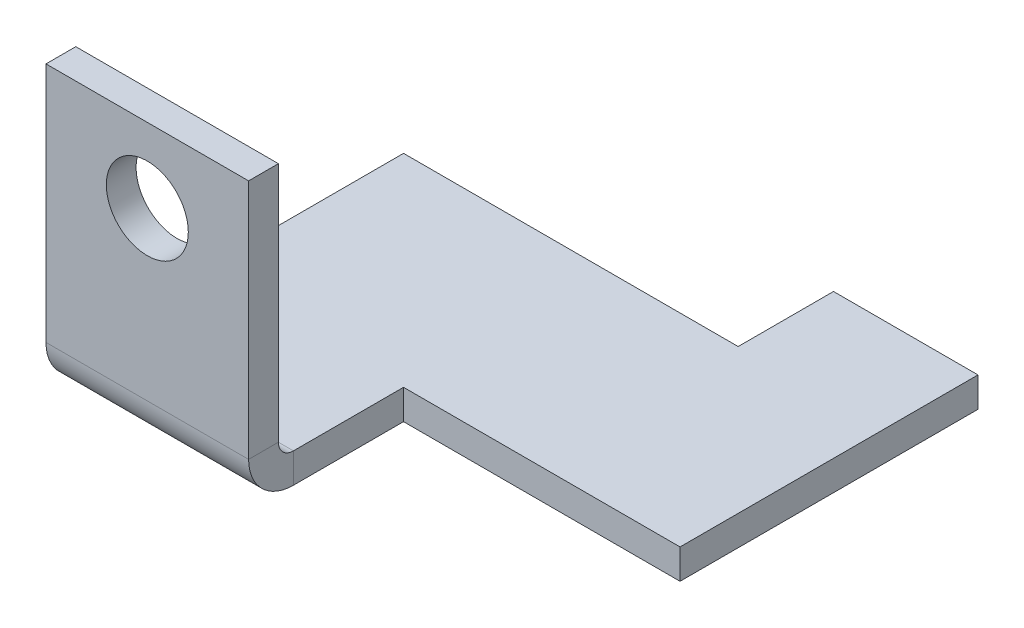
ISO-10303-21;
HEADER;
FILE_DESCRIPTION(('STEP AP214'),'2;1');
FILE_NAME('part.step','',(''),(''),'','','');
FILE_SCHEMA(('AUTOMOTIVE_DESIGN { 1 0 10303 214 1 1 1 1 }'));
ENDSEC;
DATA;
#1=APPLICATION_CONTEXT('core data for automotive mechanical design processes');
#2=APPLICATION_PROTOCOL_DEFINITION('international standard','automotive_design',2000,#1);
#3=PRODUCT_CONTEXT('',#1,'mechanical');
#4=PRODUCT('Part','Part','',(#3));
#5=PRODUCT_RELATED_PRODUCT_CATEGORY('part','',(#4));
#6=PRODUCT_DEFINITION_FORMATION('','',#4);
#7=PRODUCT_DEFINITION_CONTEXT('part definition',#1,'design');
#8=PRODUCT_DEFINITION('design','',#6,#7);
#9=PRODUCT_DEFINITION_SHAPE('','',#8);
#10=(LENGTH_UNIT() NAMED_UNIT(*) SI_UNIT(.MILLI.,.METRE.));
#11=(NAMED_UNIT(*) PLANE_ANGLE_UNIT() SI_UNIT($,.RADIAN.));
#12=(NAMED_UNIT(*) SI_UNIT($,.STERADIAN.) SOLID_ANGLE_UNIT());
#13=UNCERTAINTY_MEASURE_WITH_UNIT(LENGTH_MEASURE(1.E-05),#10,'distance_accuracy_value','');
#14=(GEOMETRIC_REPRESENTATION_CONTEXT(3) GLOBAL_UNCERTAINTY_ASSIGNED_CONTEXT((#13)) GLOBAL_UNIT_ASSIGNED_CONTEXT((#10,
#11,#12)) REPRESENTATION_CONTEXT('',''));
#15=CARTESIAN_POINT('',(0.,0.,0.));
#16=DIRECTION('',(0.,0.,1.));
#17=DIRECTION('',(1.,0.,0.));
#18=AXIS2_PLACEMENT_3D('',#15,#16,#17);
#19=CARTESIAN_POINT('',(-10.795,15.24,3.175));
#20=DIRECTION('',(-1.,0.,0.));
#21=DIRECTION('',(0.,-1.,0.));
#22=AXIS2_PLACEMENT_3D('',#19,#20,#21);
#23=PLANE('',#22);
#24=DIRECTION('',(0.,1.,0.));
#25=VECTOR('',#24,1.);
#26=CARTESIAN_POINT('',(-10.795,0.,0.));
#27=LINE('',#26,#25);
#28=CARTESIAN_POINT('',(-10.795,15.24,0.));
#29=VERTEX_POINT('',#28);
#30=CARTESIAN_POINT('',(-10.795,-10.464999898,0.));
#31=VERTEX_POINT('',#30);
#32=EDGE_CURVE('E212',#29,#31,#27,.F.);
#33=ORIENTED_EDGE('',*,*,#32,.T.);
#34=DIRECTION('',(0.,0.,1.));
#35=VECTOR('',#34,1.);
#36=CARTESIAN_POINT('',(-10.795,-10.464999898,0.));
#37=LINE('',#36,#35);
#38=CARTESIAN_POINT('',(-10.795,-10.464999898,3.175));
#39=VERTEX_POINT('',#38);
#40=EDGE_CURVE('E161',#31,#39,#37,.T.);
#41=ORIENTED_EDGE('',*,*,#40,.T.);
#42=DIRECTION('',(0.,-1.,0.));
#43=VECTOR('',#42,1.);
#44=CARTESIAN_POINT('',(-10.795,15.24,3.175));
#45=LINE('',#44,#43);
#46=CARTESIAN_POINT('',(-10.795,15.24,3.175));
#47=VERTEX_POINT('',#46);
#48=EDGE_CURVE('E204',#47,#39,#45,.T.);
#49=ORIENTED_EDGE('',*,*,#48,.F.);
#50=DIRECTION('',(0.,0.,1.));
#51=VECTOR('',#50,1.);
#52=CARTESIAN_POINT('',(-10.795,15.24,3.175));
#53=LINE('',#52,#51);
#54=EDGE_CURVE('E13',#29,#47,#53,.T.);
#55=ORIENTED_EDGE('',*,*,#54,.F.);
#56=EDGE_LOOP('',(#33,#41,#49,#55));
#57=FACE_BOUND('',#56,.T.);
#58=ADVANCED_FACE('F79',(#57),#23,.T.);
#59=CARTESIAN_POINT('',(0.,0.,3.175));
#60=DIRECTION('',(0.,0.,1.));
#61=DIRECTION('',(1.,0.,0.));
#62=AXIS2_PLACEMENT_3D('',#59,#60,#61);
#63=PLANE('',#62);
#64=CARTESIAN_POINT('',(0.,7.3025,3.175));
#65=DIRECTION('',(0.,0.,1.));
#66=DIRECTION('',(1.,0.,0.));
#67=AXIS2_PLACEMENT_3D('',#64,#65,#66);
#68=CIRCLE('',#67,4.3688);
#69=CARTESIAN_POINT('',(4.3688,7.3025,3.175));
#70=VERTEX_POINT('',#69);
#71=EDGE_CURVE('E207',#70,#70,#68,.T.);
#72=ORIENTED_EDGE('',*,*,#71,.F.);
#73=EDGE_LOOP('',(#72));
#74=FACE_BOUND('',#73,.T.);
#75=ORIENTED_EDGE('',*,*,#48,.T.);
#76=DIRECTION('',(-1.,0.,0.));
#77=VECTOR('',#76,1.);
#78=CARTESIAN_POINT('',(-10.795,-10.464999898,3.175));
#79=LINE('',#78,#77);
#80=CARTESIAN_POINT('',(10.795,-10.464999898,3.175));
#81=VERTEX_POINT('',#80);
#82=EDGE_CURVE('E121',#39,#81,#79,.F.);
#83=ORIENTED_EDGE('',*,*,#82,.T.);
#84=DIRECTION('',(0.,1.,0.));
#85=VECTOR('',#84,1.);
#86=CARTESIAN_POINT('',(10.795,15.24,3.175));
#87=LINE('',#86,#85);
#88=CARTESIAN_POINT('',(10.795,15.24,3.175));
#89=VERTEX_POINT('',#88);
#90=EDGE_CURVE('E199',#81,#89,#87,.T.);
#91=ORIENTED_EDGE('',*,*,#90,.T.);
#92=DIRECTION('',(-1.,0.,0.));
#93=VECTOR('',#92,1.);
#94=CARTESIAN_POINT('',(-10.795,15.24,3.175));
#95=LINE('',#94,#93);
#96=EDGE_CURVE('E201',#89,#47,#95,.T.);
#97=ORIENTED_EDGE('',*,*,#96,.T.);
#98=EDGE_LOOP('',(#75,#83,#91,#97));
#99=FACE_BOUND('',#98,.T.);
#100=ADVANCED_FACE('F235',(#74,#99),#63,.T.);
#101=CARTESIAN_POINT('',(0.,0.,0.));
#102=DIRECTION('',(0.,0.,1.));
#103=DIRECTION('',(1.,0.,0.));
#104=AXIS2_PLACEMENT_3D('',#101,#102,#103);
#105=PLANE('',#104);
#106=CARTESIAN_POINT('',(0.,7.3025,0.));
#107=DIRECTION('',(0.,0.,1.));
#108=DIRECTION('',(1.,0.,0.));
#109=AXIS2_PLACEMENT_3D('',#106,#107,#108);
#110=CIRCLE('',#109,4.3688);
#111=CARTESIAN_POINT('',(4.3688,7.3025,0.));
#112=VERTEX_POINT('',#111);
#113=EDGE_CURVE('E202',#112,#112,#110,.T.);
#114=ORIENTED_EDGE('',*,*,#113,.T.);
#115=EDGE_LOOP('',(#114));
#116=FACE_BOUND('',#115,.T.);
#117=DIRECTION('',(-1.,0.,0.));
#118=VECTOR('',#117,1.);
#119=CARTESIAN_POINT('',(-10.795,-10.464999898,0.));
#120=LINE('',#119,#118);
#121=CARTESIAN_POINT('',(10.795,-10.464999898,0.));
#122=VERTEX_POINT('',#121);
#123=EDGE_CURVE('E162',#31,#122,#120,.F.);
#124=ORIENTED_EDGE('',*,*,#123,.F.);
#125=ORIENTED_EDGE('',*,*,#32,.F.);
#126=DIRECTION('',(1.,0.,0.));
#127=VECTOR('',#126,1.);
#128=CARTESIAN_POINT('',(0.,15.24,0.));
#129=LINE('',#128,#127);
#130=CARTESIAN_POINT('',(10.795,15.24,0.));
#131=VERTEX_POINT('',#130);
#132=EDGE_CURVE('E211',#131,#29,#129,.F.);
#133=ORIENTED_EDGE('',*,*,#132,.F.);
#134=DIRECTION('',(0.,1.,0.));
#135=VECTOR('',#134,1.);
#136=CARTESIAN_POINT('',(10.795,0.,0.));
#137=LINE('',#136,#135);
#138=EDGE_CURVE('E115',#122,#131,#137,.T.);
#139=ORIENTED_EDGE('',*,*,#138,.F.);
#140=EDGE_LOOP('',(#124,#125,#133,#139));
#141=FACE_BOUND('',#140,.T.);
#142=ADVANCED_FACE('F219',(#116,#141),#105,.F.);
#143=CARTESIAN_POINT('',(10.795,15.24,3.175));
#144=DIRECTION('',(1.,0.,0.));
#145=DIRECTION('',(0.,1.,0.));
#146=AXIS2_PLACEMENT_3D('',#143,#144,#145);
#147=PLANE('',#146);
#148=DIRECTION('',(0.,0.,1.));
#149=VECTOR('',#148,1.);
#150=CARTESIAN_POINT('',(10.795,-10.464999898,0.));
#151=LINE('',#150,#149);
#152=EDGE_CURVE('E196',#122,#81,#151,.T.);
#153=ORIENTED_EDGE('',*,*,#152,.F.);
#154=ORIENTED_EDGE('',*,*,#138,.T.);
#155=DIRECTION('',(0.,0.,1.));
#156=VECTOR('',#155,1.);
#157=CARTESIAN_POINT('',(10.795,15.24,3.175));
#158=LINE('',#157,#156);
#159=EDGE_CURVE('E83',#131,#89,#158,.T.);
#160=ORIENTED_EDGE('',*,*,#159,.T.);
#161=ORIENTED_EDGE('',*,*,#90,.F.);
#162=EDGE_LOOP('',(#153,#154,#160,#161));
#163=FACE_BOUND('',#162,.T.);
#164=ADVANCED_FACE('F233',(#163),#147,.T.);
#165=CARTESIAN_POINT('',(-10.795,15.24,3.175));
#166=DIRECTION('',(0.,1.,0.));
#167=DIRECTION('',(-1.,0.,0.));
#168=AXIS2_PLACEMENT_3D('',#165,#166,#167);
#169=PLANE('',#168);
#170=ORIENTED_EDGE('',*,*,#132,.T.);
#171=ORIENTED_EDGE('',*,*,#54,.T.);
#172=ORIENTED_EDGE('',*,*,#96,.F.);
#173=ORIENTED_EDGE('',*,*,#159,.F.);
#174=EDGE_LOOP('',(#170,#171,#172,#173));
#175=FACE_BOUND('',#174,.T.);
#176=ADVANCED_FACE('F224',(#175),#169,.T.);
#177=CARTESIAN_POINT('',(0.,7.3025,3.175));
#178=DIRECTION('',(0.,0.,1.));
#179=DIRECTION('',(1.,0.,0.));
#180=AXIS2_PLACEMENT_3D('',#177,#178,#179);
#181=CYLINDRICAL_SURFACE('',#180,4.3688);
#182=ORIENTED_EDGE('',*,*,#71,.T.);
#183=EDGE_LOOP('',(#182));
#184=FACE_BOUND('',#183,.T.);
#185=ORIENTED_EDGE('',*,*,#113,.F.);
#186=EDGE_LOOP('',(#185));
#187=FACE_BOUND('',#186,.T.);
#188=ADVANCED_FACE('F81',(#184,#187),#181,.F.);
#189=CARTESIAN_POINT('',(10.795,-10.464999898,-1.600000102));
#190=DIRECTION('',(1.,0.,0.));
#191=DIRECTION('',(0.,0.,-1.));
#192=AXIS2_PLACEMENT_3D('',#189,#190,#191);
#193=PLANE('',#192);
#194=DIRECTION('',(0.,-1.,0.));
#195=VECTOR('',#194,1.);
#196=CARTESIAN_POINT('',(10.795,-15.24,-1.60000010199998));
#197=LINE('',#196,#195);
#198=CARTESIAN_POINT('',(10.795,-12.065,-1.60000010199999));
#199=VERTEX_POINT('',#198);
#200=CARTESIAN_POINT('',(10.795,-15.24,-1.60000010199998));
#201=VERTEX_POINT('',#200);
#202=EDGE_CURVE('E153',#199,#201,#197,.T.);
#203=ORIENTED_EDGE('',*,*,#202,.F.);
#204=CARTESIAN_POINT('',(10.795,-10.464999898,-1.600000102));
#205=DIRECTION('',(-1.,0.,0.));
#206=DIRECTION('',(0.,0.,1.));
#207=AXIS2_PLACEMENT_3D('',#204,#205,#206);
#208=CIRCLE('',#207,1.600000102);
#209=EDGE_CURVE('E147',#122,#199,#208,.F.);
#210=ORIENTED_EDGE('',*,*,#209,.F.);
#211=ORIENTED_EDGE('',*,*,#152,.T.);
#212=CARTESIAN_POINT('',(10.795,-10.464999898,-1.600000102));
#213=DIRECTION('',(-1.,0.,0.));
#214=DIRECTION('',(0.,0.,1.));
#215=AXIS2_PLACEMENT_3D('',#212,#213,#214);
#216=CIRCLE('',#215,4.775000102);
#217=EDGE_CURVE('E94',#81,#201,#216,.F.);
#218=ORIENTED_EDGE('',*,*,#217,.T.);
#219=EDGE_LOOP('',(#203,#210,#211,#218));
#220=FACE_BOUND('',#219,.T.);
#221=ADVANCED_FACE('F223',(#220),#193,.T.);
#222=CARTESIAN_POINT('',(-10.795,-10.464999898,-1.600000102));
#223=DIRECTION('',(1.,0.,0.));
#224=DIRECTION('',(0.,0.,-1.));
#225=AXIS2_PLACEMENT_3D('',#222,#223,#224);
#226=PLANE('',#225);
#227=CARTESIAN_POINT('',(-10.795,-10.464999898,-1.600000102));
#228=DIRECTION('',(-1.,0.,0.));
#229=DIRECTION('',(0.,0.,1.));
#230=AXIS2_PLACEMENT_3D('',#227,#228,#229);
#231=CIRCLE('',#230,1.600000102);
#232=CARTESIAN_POINT('',(-10.795,-12.065,-1.60000010199999));
#233=VERTEX_POINT('',#232);
#234=EDGE_CURVE('E144',#233,#31,#231,.T.);
#235=ORIENTED_EDGE('',*,*,#234,.F.);
#236=DIRECTION('',(0.,-1.,0.));
#237=VECTOR('',#236,1.);
#238=CARTESIAN_POINT('',(-10.795,-12.065,-1.60000010199999));
#239=LINE('',#238,#237);
#240=CARTESIAN_POINT('',(-10.795,-15.24,-1.60000010199998));
#241=VERTEX_POINT('',#240);
#242=EDGE_CURVE('E152',#233,#241,#239,.T.);
#243=ORIENTED_EDGE('',*,*,#242,.T.);
#244=CARTESIAN_POINT('',(-10.795,-10.464999898,-1.600000102));
#245=DIRECTION('',(-1.,0.,0.));
#246=DIRECTION('',(0.,0.,1.));
#247=AXIS2_PLACEMENT_3D('',#244,#245,#246);
#248=CIRCLE('',#247,4.775000102);
#249=EDGE_CURVE('E191',#241,#39,#248,.T.);
#250=ORIENTED_EDGE('',*,*,#249,.T.);
#251=ORIENTED_EDGE('',*,*,#40,.F.);
#252=EDGE_LOOP('',(#235,#243,#250,#251));
#253=FACE_BOUND('',#252,.T.);
#254=ADVANCED_FACE('F157',(#253),#226,.F.);
#255=CARTESIAN_POINT('',(-10.795,-10.464999898,-1.600000102));
#256=DIRECTION('',(-1.,0.,0.));
#257=DIRECTION('',(0.,-1.,0.));
#258=AXIS2_PLACEMENT_3D('',#255,#256,#257);
#259=CYLINDRICAL_SURFACE('',#258,4.775000102);
#260=ORIENTED_EDGE('',*,*,#82,.F.);
#261=ORIENTED_EDGE('',*,*,#249,.F.);
#262=DIRECTION('',(-1.,0.,0.));
#263=VECTOR('',#262,1.);
#264=CARTESIAN_POINT('',(0.,-15.24,-1.60000010199998));
#265=LINE('',#264,#263);
#266=EDGE_CURVE('E182',#201,#241,#265,.T.);
#267=ORIENTED_EDGE('',*,*,#266,.F.);
#268=ORIENTED_EDGE('',*,*,#217,.F.);
#269=EDGE_LOOP('',(#260,#261,#267,#268));
#270=FACE_BOUND('',#269,.T.);
#271=ADVANCED_FACE('F249',(#270),#259,.T.);
#272=CARTESIAN_POINT('',(-10.795,-10.464999898,-1.600000102));
#273=DIRECTION('',(-1.,0.,0.));
#274=DIRECTION('',(0.,-1.,0.));
#275=AXIS2_PLACEMENT_3D('',#272,#273,#274);
#276=CYLINDRICAL_SURFACE('',#275,1.600000102);
#277=ORIENTED_EDGE('',*,*,#123,.T.);
#278=ORIENTED_EDGE('',*,*,#209,.T.);
#279=DIRECTION('',(1.,0.,0.));
#280=VECTOR('',#279,1.);
#281=CARTESIAN_POINT('',(10.795,-12.065,-1.60000010199999));
#282=LINE('',#281,#280);
#283=EDGE_CURVE('E141',#199,#233,#282,.F.);
#284=ORIENTED_EDGE('',*,*,#283,.T.);
#285=ORIENTED_EDGE('',*,*,#234,.T.);
#286=EDGE_LOOP('',(#277,#278,#284,#285));
#287=FACE_BOUND('',#286,.T.);
#288=ADVANCED_FACE('F143',(#287),#276,.F.);
#289=CARTESIAN_POINT('',(-10.795,-15.24,0.));
#290=DIRECTION('',(-1.,0.,0.));
#291=DIRECTION('',(0.,0.,1.));
#292=AXIS2_PLACEMENT_3D('',#289,#290,#291);
#293=PLANE('',#292);
#294=DIRECTION('',(0.,0.,1.));
#295=VECTOR('',#294,1.);
#296=CARTESIAN_POINT('',(-10.795,-15.24,0.));
#297=LINE('',#296,#295);
#298=CARTESIAN_POINT('',(-10.795,-15.2400000000001,-34.925));
#299=VERTEX_POINT('',#298);
#300=EDGE_CURVE('E181',#299,#241,#297,.T.);
#301=ORIENTED_EDGE('',*,*,#300,.T.);
#302=ORIENTED_EDGE('',*,*,#242,.F.);
#303=DIRECTION('',(0.,0.,-1.));
#304=VECTOR('',#303,1.);
#305=CARTESIAN_POINT('',(-10.795,-12.065,0.));
#306=LINE('',#305,#304);
#307=CARTESIAN_POINT('',(-10.795,-12.0650000000001,-34.925));
#308=VERTEX_POINT('',#307);
#309=EDGE_CURVE('E167',#308,#233,#306,.F.);
#310=ORIENTED_EDGE('',*,*,#309,.F.);
#311=DIRECTION('',(0.,1.,0.));
#312=VECTOR('',#311,1.);
#313=CARTESIAN_POINT('',(-10.795,-15.2400000000001,-34.925));
#314=LINE('',#313,#312);
#315=EDGE_CURVE('E163',#299,#308,#314,.T.);
#316=ORIENTED_EDGE('',*,*,#315,.F.);
#317=EDGE_LOOP('',(#301,#302,#310,#316));
#318=FACE_BOUND('',#317,.T.);
#319=ADVANCED_FACE('F179',(#318),#293,.T.);
#320=CARTESIAN_POINT('',(10.795,-15.24,-13.335));
#321=DIRECTION('',(1.,0.,0.));
#322=DIRECTION('',(0.,0.,-1.));
#323=AXIS2_PLACEMENT_3D('',#320,#321,#322);
#324=PLANE('',#323);
#325=DIRECTION('',(0.,0.,1.));
#326=VECTOR('',#325,1.);
#327=CARTESIAN_POINT('',(10.795,-12.065,0.));
#328=LINE('',#327,#326);
#329=CARTESIAN_POINT('',(10.795,-12.065,-13.335));
#330=VERTEX_POINT('',#329);
#331=EDGE_CURVE('E184',#199,#330,#328,.F.);
#332=ORIENTED_EDGE('',*,*,#331,.F.);
#333=ORIENTED_EDGE('',*,*,#202,.T.);
#334=DIRECTION('',(0.,0.,-1.));
#335=VECTOR('',#334,1.);
#336=CARTESIAN_POINT('',(10.795,-15.24,-13.335));
#337=LINE('',#336,#335);
#338=CARTESIAN_POINT('',(10.795,-15.24,-13.335));
#339=VERTEX_POINT('',#338);
#340=EDGE_CURVE('E176',#201,#339,#337,.T.);
#341=ORIENTED_EDGE('',*,*,#340,.T.);
#342=DIRECTION('',(0.,-1.,0.));
#343=VECTOR('',#342,1.);
#344=CARTESIAN_POINT('',(10.795,-15.24,-13.335));
#345=LINE('',#344,#343);
#346=EDGE_CURVE('E317',#339,#330,#345,.F.);
#347=ORIENTED_EDGE('',*,*,#346,.T.);
#348=EDGE_LOOP('',(#332,#333,#341,#347));
#349=FACE_BOUND('',#348,.T.);
#350=ADVANCED_FACE('F255',(#349),#324,.T.);
#351=CARTESIAN_POINT('',(0.,-15.24,0.));
#352=DIRECTION('',(0.,-1.,0.));
#353=DIRECTION('',(0.,0.,-1.));
#354=AXIS2_PLACEMENT_3D('',#351,#352,#353);
#355=PLANE('',#354);
#356=ORIENTED_EDGE('',*,*,#340,.F.);
#357=ORIENTED_EDGE('',*,*,#266,.T.);
#358=ORIENTED_EDGE('',*,*,#300,.F.);
#359=DIRECTION('',(-1.,0.,0.));
#360=VECTOR('',#359,1.);
#361=CARTESIAN_POINT('',(-10.795,-15.2400000000001,-34.925));
#362=LINE('',#361,#360);
#363=CARTESIAN_POINT('',(24.8623992636857,-15.2400000000001,-34.925));
#364=VERTEX_POINT('',#363);
#365=EDGE_CURVE('E324',#364,#299,#362,.T.);
#366=ORIENTED_EDGE('',*,*,#365,.F.);
#367=DIRECTION('',(0.,0.,1.));
#368=VECTOR('',#367,1.);
#369=CARTESIAN_POINT('',(24.8623992636857,-15.2400000000001,-45.085));
#370=LINE('',#369,#368);
#371=CARTESIAN_POINT('',(24.8623992636857,-15.2400000000001,-45.085));
#372=VERTEX_POINT('',#371);
#373=EDGE_CURVE('E330',#372,#364,#370,.T.);
#374=ORIENTED_EDGE('',*,*,#373,.F.);
#375=DIRECTION('',(-1.,0.,0.));
#376=VECTOR('',#375,1.);
#377=CARTESIAN_POINT('',(26.3863992636857,-15.2400000000001,-45.085));
#378=LINE('',#377,#376);
#379=CARTESIAN_POINT('',(40.259,-15.2400000000001,-45.085));
#380=VERTEX_POINT('',#379);
#381=EDGE_CURVE('E333',#380,#372,#378,.T.);
#382=ORIENTED_EDGE('',*,*,#381,.F.);
#383=DIRECTION('',(0.,0.,-1.));
#384=VECTOR('',#383,1.);
#385=CARTESIAN_POINT('',(40.259,-15.2400000000001,-45.085));
#386=LINE('',#385,#384);
#387=CARTESIAN_POINT('',(40.259,-15.24,-13.335));
#388=VERTEX_POINT('',#387);
#389=EDGE_CURVE('E298',#388,#380,#386,.T.);
#390=ORIENTED_EDGE('',*,*,#389,.F.);
#391=DIRECTION('',(1.,0.,0.));
#392=VECTOR('',#391,1.);
#393=CARTESIAN_POINT('',(38.735,-15.24,-13.335));
#394=LINE('',#393,#392);
#395=EDGE_CURVE('E294',#339,#388,#394,.T.);
#396=ORIENTED_EDGE('',*,*,#395,.F.);
#397=EDGE_LOOP('',(#356,#357,#358,#366,#374,#382,#390,#396));
#398=FACE_BOUND('',#397,.T.);
#399=ADVANCED_FACE('F258',(#398),#355,.T.);
#400=CARTESIAN_POINT('',(0.,-12.065,0.));
#401=DIRECTION('',(0.,-1.,0.));
#402=DIRECTION('',(0.,0.,-1.));
#403=AXIS2_PLACEMENT_3D('',#400,#401,#402);
#404=PLANE('',#403);
#405=ORIENTED_EDGE('',*,*,#283,.F.);
#406=ORIENTED_EDGE('',*,*,#331,.T.);
#407=DIRECTION('',(-1.,0.,0.));
#408=VECTOR('',#407,1.);
#409=CARTESIAN_POINT('',(0.,-12.065,-13.335));
#410=LINE('',#409,#408);
#411=CARTESIAN_POINT('',(40.259,-12.065,-13.335));
#412=VERTEX_POINT('',#411);
#413=EDGE_CURVE('E311',#330,#412,#410,.F.);
#414=ORIENTED_EDGE('',*,*,#413,.T.);
#415=DIRECTION('',(0.,0.,1.));
#416=VECTOR('',#415,1.);
#417=CARTESIAN_POINT('',(40.259,-12.065,0.));
#418=LINE('',#417,#416);
#419=CARTESIAN_POINT('',(40.259,-12.0650000000002,-45.085));
#420=VERTEX_POINT('',#419);
#421=EDGE_CURVE('E308',#412,#420,#418,.F.);
#422=ORIENTED_EDGE('',*,*,#421,.T.);
#423=DIRECTION('',(1.,0.,0.));
#424=VECTOR('',#423,1.);
#425=CARTESIAN_POINT('',(0.,-12.0650000000002,-45.085));
#426=LINE('',#425,#424);
#427=CARTESIAN_POINT('',(24.8623992636857,-12.0650000000002,-45.085));
#428=VERTEX_POINT('',#427);
#429=EDGE_CURVE('E305',#420,#428,#426,.F.);
#430=ORIENTED_EDGE('',*,*,#429,.T.);
#431=DIRECTION('',(0.,0.,-1.));
#432=VECTOR('',#431,1.);
#433=CARTESIAN_POINT('',(24.8623992636857,-12.065,0.));
#434=LINE('',#433,#432);
#435=CARTESIAN_POINT('',(24.8623992636857,-12.0650000000001,-34.925));
#436=VERTEX_POINT('',#435);
#437=EDGE_CURVE('E303',#428,#436,#434,.F.);
#438=ORIENTED_EDGE('',*,*,#437,.T.);
#439=DIRECTION('',(1.,0.,0.));
#440=VECTOR('',#439,1.);
#441=CARTESIAN_POINT('',(0.,-12.0650000000001,-34.925));
#442=LINE('',#441,#440);
#443=EDGE_CURVE('E172',#436,#308,#442,.F.);
#444=ORIENTED_EDGE('',*,*,#443,.T.);
#445=ORIENTED_EDGE('',*,*,#309,.T.);
#446=EDGE_LOOP('',(#405,#406,#414,#422,#430,#438,#444,#445));
#447=FACE_BOUND('',#446,.T.);
#448=ADVANCED_FACE('F168',(#447),#404,.F.);
#449=CARTESIAN_POINT('',(-10.795,-15.2400000000001,-34.925));
#450=DIRECTION('',(0.,0.,-1.));
#451=DIRECTION('',(0.,1.,0.));
#452=AXIS2_PLACEMENT_3D('',#449,#450,#451);
#453=PLANE('',#452);
#454=ORIENTED_EDGE('',*,*,#443,.F.);
#455=DIRECTION('',(0.,-1.,0.));
#456=VECTOR('',#455,1.);
#457=CARTESIAN_POINT('',(24.8623992636857,-15.2400000000001,-34.925));
#458=LINE('',#457,#456);
#459=EDGE_CURVE('E362',#364,#436,#458,.F.);
#460=ORIENTED_EDGE('',*,*,#459,.F.);
#461=ORIENTED_EDGE('',*,*,#365,.T.);
#462=ORIENTED_EDGE('',*,*,#315,.T.);
#463=EDGE_LOOP('',(#454,#460,#461,#462));
#464=FACE_BOUND('',#463,.T.);
#465=ADVANCED_FACE('F275',(#464),#453,.T.);
#466=CARTESIAN_POINT('',(24.8623992636857,-15.2400000000001,-45.085));
#467=DIRECTION('',(-1.,0.,0.));
#468=DIRECTION('',(0.,0.,1.));
#469=AXIS2_PLACEMENT_3D('',#466,#467,#468);
#470=PLANE('',#469);
#471=ORIENTED_EDGE('',*,*,#437,.F.);
#472=DIRECTION('',(0.,1.,0.));
#473=VECTOR('',#472,1.);
#474=CARTESIAN_POINT('',(24.8623992636857,-15.2400000000001,-45.085));
#475=LINE('',#474,#473);
#476=EDGE_CURVE('E358',#372,#428,#475,.T.);
#477=ORIENTED_EDGE('',*,*,#476,.F.);
#478=ORIENTED_EDGE('',*,*,#373,.T.);
#479=ORIENTED_EDGE('',*,*,#459,.T.);
#480=EDGE_LOOP('',(#471,#477,#478,#479));
#481=FACE_BOUND('',#480,.T.);
#482=ADVANCED_FACE('F271',(#481),#470,.T.);
#483=CARTESIAN_POINT('',(26.3863992636857,-15.2400000000001,-45.085));
#484=DIRECTION('',(0.,0.,-1.));
#485=DIRECTION('',(0.,1.,0.));
#486=AXIS2_PLACEMENT_3D('',#483,#484,#485);
#487=PLANE('',#486);
#488=ORIENTED_EDGE('',*,*,#429,.F.);
#489=DIRECTION('',(0.,1.,0.));
#490=VECTOR('',#489,1.);
#491=CARTESIAN_POINT('',(40.259,-15.2400000000001,-45.085));
#492=LINE('',#491,#490);
#493=EDGE_CURVE('E322',#380,#420,#492,.T.);
#494=ORIENTED_EDGE('',*,*,#493,.F.);
#495=ORIENTED_EDGE('',*,*,#381,.T.);
#496=ORIENTED_EDGE('',*,*,#476,.T.);
#497=EDGE_LOOP('',(#488,#494,#495,#496));
#498=FACE_BOUND('',#497,.T.);
#499=ADVANCED_FACE('F267',(#498),#487,.T.);
#500=CARTESIAN_POINT('',(40.259,-15.2400000000001,-45.085));
#501=DIRECTION('',(1.,0.,0.));
#502=DIRECTION('',(0.,0.,-1.));
#503=AXIS2_PLACEMENT_3D('',#500,#501,#502);
#504=PLANE('',#503);
#505=ORIENTED_EDGE('',*,*,#421,.F.);
#506=DIRECTION('',(0.,1.,0.));
#507=VECTOR('',#506,1.);
#508=CARTESIAN_POINT('',(40.259,-15.24,-13.335));
#509=LINE('',#508,#507);
#510=EDGE_CURVE('E319',#388,#412,#509,.T.);
#511=ORIENTED_EDGE('',*,*,#510,.F.);
#512=ORIENTED_EDGE('',*,*,#389,.T.);
#513=ORIENTED_EDGE('',*,*,#493,.T.);
#514=EDGE_LOOP('',(#505,#511,#512,#513));
#515=FACE_BOUND('',#514,.T.);
#516=ADVANCED_FACE('F263',(#515),#504,.T.);
#517=CARTESIAN_POINT('',(38.735,-15.24,-13.335));
#518=DIRECTION('',(0.,0.,1.));
#519=DIRECTION('',(0.,-1.,0.));
#520=AXIS2_PLACEMENT_3D('',#517,#518,#519);
#521=PLANE('',#520);
#522=ORIENTED_EDGE('',*,*,#413,.F.);
#523=ORIENTED_EDGE('',*,*,#346,.F.);
#524=ORIENTED_EDGE('',*,*,#395,.T.);
#525=ORIENTED_EDGE('',*,*,#510,.T.);
#526=EDGE_LOOP('',(#522,#523,#524,#525));
#527=FACE_BOUND('',#526,.T.);
#528=ADVANCED_FACE('F260',(#527),#521,.T.);
#529=CLOSED_SHELL('',(#58,#100,#142,#164,#176,#188,#221,#254,#271,#288,#319,#350,#399,#448,#465,
#482,#499,#516,#528));
#530=MANIFOLD_SOLID_BREP('B2',#529);
#531=ADVANCED_BREP_SHAPE_REPRESENTATION('',(#18,#530),#14);
#532=SHAPE_DEFINITION_REPRESENTATION(#9,#531);
ENDSEC;
END-ISO-10303-21;
